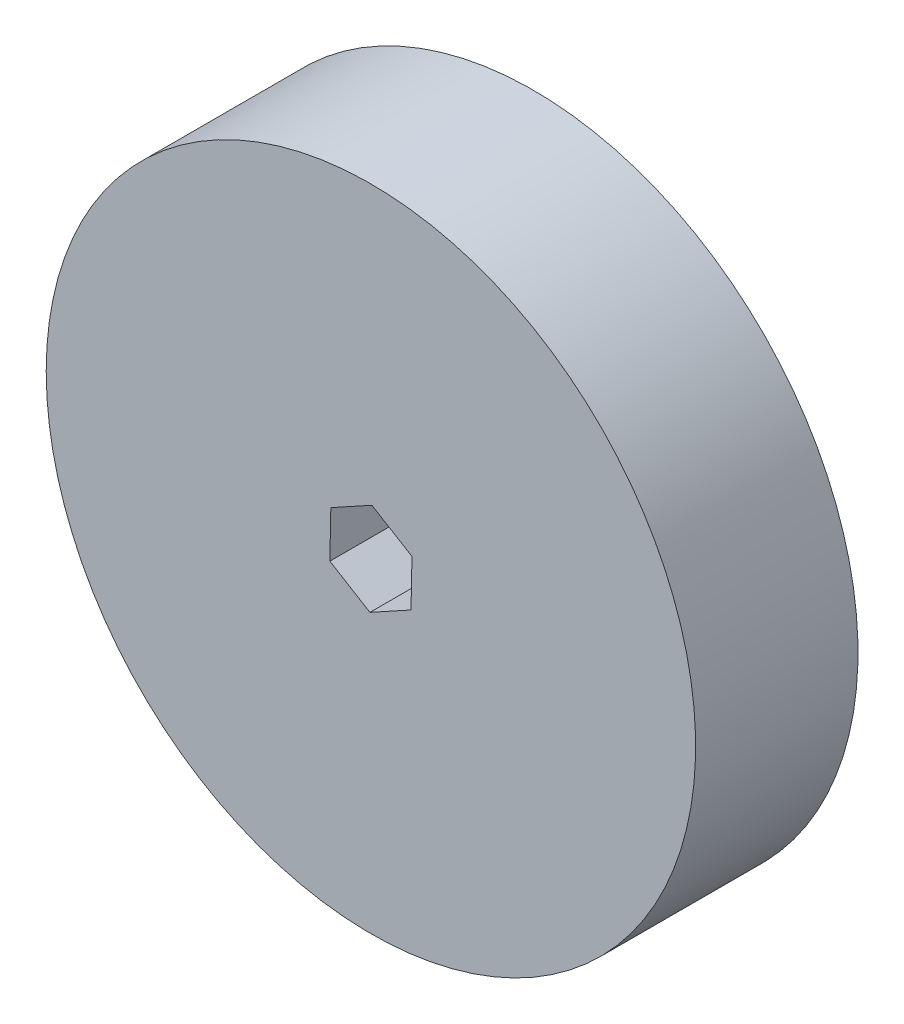
ISO-10303-21;
HEADER;
FILE_DESCRIPTION(('STEP AP214'),'2;1');
FILE_NAME('part.step','',(''),(''),'','','');
FILE_SCHEMA(('AUTOMOTIVE_DESIGN { 1 0 10303 214 1 1 1 1 }'));
ENDSEC;
DATA;
#1=APPLICATION_CONTEXT('core data for automotive mechanical design processes');
#2=APPLICATION_PROTOCOL_DEFINITION('international standard','automotive_design',2000,#1);
#3=PRODUCT_CONTEXT('',#1,'mechanical');
#4=PRODUCT('Part','Part','',(#3));
#5=PRODUCT_RELATED_PRODUCT_CATEGORY('part','',(#4));
#6=PRODUCT_DEFINITION_FORMATION('','',#4);
#7=PRODUCT_DEFINITION_CONTEXT('part definition',#1,'design');
#8=PRODUCT_DEFINITION('design','',#6,#7);
#9=PRODUCT_DEFINITION_SHAPE('','',#8);
#10=(LENGTH_UNIT() NAMED_UNIT(*) SI_UNIT(.MILLI.,.METRE.));
#11=(NAMED_UNIT(*) PLANE_ANGLE_UNIT() SI_UNIT($,.RADIAN.));
#12=(NAMED_UNIT(*) SI_UNIT($,.STERADIAN.) SOLID_ANGLE_UNIT());
#13=UNCERTAINTY_MEASURE_WITH_UNIT(LENGTH_MEASURE(1.E-05),#10,'distance_accuracy_value','');
#14=(GEOMETRIC_REPRESENTATION_CONTEXT(3) GLOBAL_UNCERTAINTY_ASSIGNED_CONTEXT((#13)) GLOBAL_UNIT_ASSIGNED_CONTEXT((#10,
#11,#12)) REPRESENTATION_CONTEXT('',''));
#15=CARTESIAN_POINT('',(0.,0.,0.));
#16=DIRECTION('',(0.,0.,1.));
#17=DIRECTION('',(1.,0.,0.));
#18=AXIS2_PLACEMENT_3D('',#15,#16,#17);
#19=CARTESIAN_POINT('',(0.,0.,19.05));
#20=DIRECTION('',(0.,0.,1.));
#21=DIRECTION('',(1.,0.,0.));
#22=AXIS2_PLACEMENT_3D('',#19,#20,#21);
#23=PLANE('',#22);
#24=CARTESIAN_POINT('',(0.,0.,19.05));
#25=DIRECTION('',(0.,0.,1.));
#26=DIRECTION('',(1.,0.,0.));
#27=AXIS2_PLACEMENT_3D('',#24,#25,#26);
#28=CIRCLE('',#27,38.1);
#29=CARTESIAN_POINT('',(-38.1,0.,19.05));
#30=VERTEX_POINT('',#29);
#31=EDGE_CURVE('E11',#30,#30,#28,.T.);
#32=ORIENTED_EDGE('',*,*,#31,.T.);
#33=EDGE_LOOP('',(#32));
#34=FACE_BOUND('',#33,.T.);
#35=DIRECTION('',(-0.855461834201049,0.517865861227959,0.));
#36=VECTOR('',#35,1.);
#37=CARTESIAN_POINT('',(4.81854024932415,2.65019713712832,19.05));
#38=LINE('',#37,#36);
#39=CARTESIAN_POINT('',(4.81854024932415,2.65019713712832,19.05));
#40=VERTEX_POINT('',#39);
#41=CARTESIAN_POINT('',(0.114132078872162,5.49807683363668,19.05));
#42=VERTEX_POINT('',#41);
#43=EDGE_CURVE('E94',#40,#42,#38,.T.);
#44=ORIENTED_EDGE('',*,*,#43,.F.);
#45=DIRECTION('',(0.020754074475595,0.99978461100012,0.));
#46=VECTOR('',#45,1.);
#47=CARTESIAN_POINT('',(4.70440817045199,-2.84787969650836,19.05));
#48=LINE('',#47,#46);
#49=CARTESIAN_POINT('',(4.70440817045199,-2.84787969650836,19.05));
#50=VERTEX_POINT('',#49);
#51=EDGE_CURVE('E86',#50,#40,#48,.T.);
#52=ORIENTED_EDGE('',*,*,#51,.F.);
#53=DIRECTION('',(0.876215908676644,0.481918749772161,0.));
#54=VECTOR('',#53,1.);
#55=CARTESIAN_POINT('',(-0.114132078872163,-5.49807683363668,19.05));
#56=LINE('',#55,#54);
#57=CARTESIAN_POINT('',(-0.114132078872164,-5.49807683363669,19.05));
#58=VERTEX_POINT('',#57);
#59=EDGE_CURVE('E114',#58,#50,#56,.T.);
#60=ORIENTED_EDGE('',*,*,#59,.F.);
#61=DIRECTION('',(0.855461834201049,-0.51786586122796,0.));
#62=VECTOR('',#61,1.);
#63=CARTESIAN_POINT('',(-4.81854024932415,-2.65019713712832,19.05));
#64=LINE('',#63,#62);
#65=CARTESIAN_POINT('',(-4.81854024932415,-2.65019713712832,19.05));
#66=VERTEX_POINT('',#65);
#67=EDGE_CURVE('E112',#66,#58,#64,.T.);
#68=ORIENTED_EDGE('',*,*,#67,.F.);
#69=DIRECTION('',(-0.020754074475595,-0.99978461100012,0.));
#70=VECTOR('',#69,1.);
#71=CARTESIAN_POINT('',(-4.70440817045199,2.84787969650836,19.05));
#72=LINE('',#71,#70);
#73=CARTESIAN_POINT('',(-4.70440817045199,2.84787969650836,19.05));
#74=VERTEX_POINT('',#73);
#75=EDGE_CURVE('E108',#74,#66,#72,.T.);
#76=ORIENTED_EDGE('',*,*,#75,.F.);
#77=DIRECTION('',(-0.876215908676644,-0.481918749772161,0.));
#78=VECTOR('',#77,1.);
#79=CARTESIAN_POINT('',(0.114132078872162,5.49807683363668,19.05));
#80=LINE('',#79,#78);
#81=EDGE_CURVE('E106',#42,#74,#80,.T.);
#82=ORIENTED_EDGE('',*,*,#81,.F.);
#83=EDGE_LOOP('',(#44,#52,#60,#68,#76,#82));
#84=FACE_BOUND('',#83,.T.);
#85=ADVANCED_FACE('F33',(#34,#84),#23,.T.);
#86=CARTESIAN_POINT('',(0.,0.,0.));
#87=DIRECTION('',(0.,0.,1.));
#88=DIRECTION('',(1.,0.,0.));
#89=AXIS2_PLACEMENT_3D('',#86,#87,#88);
#90=PLANE('',#89);
#91=CARTESIAN_POINT('',(0.,0.,0.));
#92=DIRECTION('',(0.,0.,1.));
#93=DIRECTION('',(1.,0.,0.));
#94=AXIS2_PLACEMENT_3D('',#91,#92,#93);
#95=CIRCLE('',#94,38.1);
#96=CARTESIAN_POINT('',(-38.1,0.,0.));
#97=VERTEX_POINT('',#96);
#98=EDGE_CURVE('E37',#97,#97,#95,.T.);
#99=ORIENTED_EDGE('',*,*,#98,.F.);
#100=EDGE_LOOP('',(#99));
#101=FACE_BOUND('',#100,.T.);
#102=DIRECTION('',(0.020754074475595,0.99978461100012,0.));
#103=VECTOR('',#102,1.);
#104=CARTESIAN_POINT('',(4.70440817045199,-2.84787969650836,0.));
#105=LINE('',#104,#103);
#106=CARTESIAN_POINT('',(4.70440817045199,-2.84787969650836,0.));
#107=VERTEX_POINT('',#106);
#108=CARTESIAN_POINT('',(4.81854024932415,2.65019713712832,0.));
#109=VERTEX_POINT('',#108);
#110=EDGE_CURVE('E56',#107,#109,#105,.T.);
#111=ORIENTED_EDGE('',*,*,#110,.T.);
#112=DIRECTION('',(-0.855461834201049,0.517865861227959,0.));
#113=VECTOR('',#112,1.);
#114=CARTESIAN_POINT('',(4.81854024932415,2.65019713712832,0.));
#115=LINE('',#114,#113);
#116=CARTESIAN_POINT('',(0.114132078872162,5.49807683363668,0.));
#117=VERTEX_POINT('',#116);
#118=EDGE_CURVE('E101',#109,#117,#115,.T.);
#119=ORIENTED_EDGE('',*,*,#118,.T.);
#120=DIRECTION('',(-0.876215908676644,-0.481918749772161,0.));
#121=VECTOR('',#120,1.);
#122=CARTESIAN_POINT('',(0.114132078872162,5.49807683363668,0.));
#123=LINE('',#122,#121);
#124=CARTESIAN_POINT('',(-4.70440817045199,2.84787969650836,0.));
#125=VERTEX_POINT('',#124);
#126=EDGE_CURVE('E118',#117,#125,#123,.T.);
#127=ORIENTED_EDGE('',*,*,#126,.T.);
#128=DIRECTION('',(-0.020754074475595,-0.99978461100012,0.));
#129=VECTOR('',#128,1.);
#130=CARTESIAN_POINT('',(-4.70440817045199,2.84787969650836,0.));
#131=LINE('',#130,#129);
#132=CARTESIAN_POINT('',(-4.81854024932415,-2.65019713712832,0.));
#133=VERTEX_POINT('',#132);
#134=EDGE_CURVE('E121',#125,#133,#131,.T.);
#135=ORIENTED_EDGE('',*,*,#134,.T.);
#136=DIRECTION('',(0.855461834201049,-0.51786586122796,0.));
#137=VECTOR('',#136,1.);
#138=CARTESIAN_POINT('',(-4.81854024932415,-2.65019713712832,0.));
#139=LINE('',#138,#137);
#140=CARTESIAN_POINT('',(-0.114132078872163,-5.49807683363668,0.));
#141=VERTEX_POINT('',#140);
#142=EDGE_CURVE('E124',#133,#141,#139,.T.);
#143=ORIENTED_EDGE('',*,*,#142,.T.);
#144=DIRECTION('',(0.876215908676644,0.481918749772161,0.));
#145=VECTOR('',#144,1.);
#146=CARTESIAN_POINT('',(-0.114132078872163,-5.49807683363668,0.));
#147=LINE('',#146,#145);
#148=EDGE_CURVE('E95',#141,#107,#147,.T.);
#149=ORIENTED_EDGE('',*,*,#148,.T.);
#150=EDGE_LOOP('',(#111,#119,#127,#135,#143,#149));
#151=FACE_BOUND('',#150,.T.);
#152=ADVANCED_FACE('F141',(#101,#151),#90,.F.);
#153=CARTESIAN_POINT('',(0.,0.,19.05));
#154=DIRECTION('',(0.,0.,-1.));
#155=DIRECTION('',(-1.,0.,0.));
#156=AXIS2_PLACEMENT_3D('',#153,#154,#155);
#157=CYLINDRICAL_SURFACE('',#156,38.1);
#158=CARTESIAN_POINT('',(-38.1,0.,19.05));
#159=CARTESIAN_POINT('',(-38.1,0.,18.8515625));
#160=CARTESIAN_POINT('',(-38.1,0.,18.653125));
#161=CARTESIAN_POINT('',(-38.1,0.,18.25625));
#162=CARTESIAN_POINT('',(-38.1,0.,18.0578125));
#163=CARTESIAN_POINT('',(-38.1,0.,17.6609375));
#164=CARTESIAN_POINT('',(-38.1,0.,17.4625));
#165=CARTESIAN_POINT('',(-38.1,0.,17.065625));
#166=CARTESIAN_POINT('',(-38.1,0.,16.8671875));
#167=CARTESIAN_POINT('',(-38.1,0.,16.4703125));
#168=CARTESIAN_POINT('',(-38.1,0.,16.271875));
#169=CARTESIAN_POINT('',(-38.1,0.,15.875));
#170=CARTESIAN_POINT('',(-38.1,0.,15.6765625));
#171=CARTESIAN_POINT('',(-38.1,0.,15.2796875));
#172=CARTESIAN_POINT('',(-38.1,0.,15.08125));
#173=CARTESIAN_POINT('',(-38.1,0.,14.684375));
#174=CARTESIAN_POINT('',(-38.1,0.,14.4859375));
#175=CARTESIAN_POINT('',(-38.1,0.,14.0890625));
#176=CARTESIAN_POINT('',(-38.1,0.,13.890625));
#177=CARTESIAN_POINT('',(-38.1,0.,13.49375));
#178=CARTESIAN_POINT('',(-38.1,0.,13.2953125));
#179=CARTESIAN_POINT('',(-38.1,0.,12.8984375));
#180=CARTESIAN_POINT('',(-38.1,0.,12.7));
#181=CARTESIAN_POINT('',(-38.1,0.,12.303125));
#182=CARTESIAN_POINT('',(-38.1,0.,12.1046875));
#183=CARTESIAN_POINT('',(-38.1,0.,11.7078125));
#184=CARTESIAN_POINT('',(-38.1,0.,11.509375));
#185=CARTESIAN_POINT('',(-38.1,0.,11.1125));
#186=CARTESIAN_POINT('',(-38.1,0.,10.9140625));
#187=CARTESIAN_POINT('',(-38.1,0.,10.5171875));
#188=CARTESIAN_POINT('',(-38.1,0.,10.31875));
#189=CARTESIAN_POINT('',(-38.1,0.,9.921875));
#190=CARTESIAN_POINT('',(-38.1,0.,9.7234375));
#191=CARTESIAN_POINT('',(-38.1,0.,9.3265625));
#192=CARTESIAN_POINT('',(-38.1,0.,9.128125));
#193=CARTESIAN_POINT('',(-38.1,0.,8.73125));
#194=CARTESIAN_POINT('',(-38.1,0.,8.5328125));
#195=CARTESIAN_POINT('',(-38.1,0.,8.1359375));
#196=CARTESIAN_POINT('',(-38.1,0.,7.9375));
#197=CARTESIAN_POINT('',(-38.1,0.,7.540625));
#198=CARTESIAN_POINT('',(-38.1,0.,7.3421875));
#199=CARTESIAN_POINT('',(-38.1,0.,6.9453125));
#200=CARTESIAN_POINT('',(-38.1,0.,6.746875));
#201=CARTESIAN_POINT('',(-38.1,0.,6.35));
#202=CARTESIAN_POINT('',(-38.1,0.,6.1515625));
#203=CARTESIAN_POINT('',(-38.1,0.,5.7546875));
#204=CARTESIAN_POINT('',(-38.1,0.,5.55625));
#205=CARTESIAN_POINT('',(-38.1,0.,5.159375));
#206=CARTESIAN_POINT('',(-38.1,0.,4.9609375));
#207=CARTESIAN_POINT('',(-38.1,0.,4.5640625));
#208=CARTESIAN_POINT('',(-38.1,0.,4.365625));
#209=CARTESIAN_POINT('',(-38.1,0.,3.96875));
#210=CARTESIAN_POINT('',(-38.1,0.,3.7703125));
#211=CARTESIAN_POINT('',(-38.1,0.,3.3734375));
#212=CARTESIAN_POINT('',(-38.1,0.,3.175));
#213=CARTESIAN_POINT('',(-38.1,0.,2.778125));
#214=CARTESIAN_POINT('',(-38.1,0.,2.5796875));
#215=CARTESIAN_POINT('',(-38.1,0.,2.1828125));
#216=CARTESIAN_POINT('',(-38.1,0.,1.984375));
#217=CARTESIAN_POINT('',(-38.1,0.,1.5875));
#218=CARTESIAN_POINT('',(-38.1,0.,1.3890625));
#219=CARTESIAN_POINT('',(-38.1,0.,0.992187500000001));
#220=CARTESIAN_POINT('',(-38.1,0.,0.793750000000001));
#221=CARTESIAN_POINT('',(-38.1,0.,0.396875));
#222=CARTESIAN_POINT('',(-38.1,0.,0.1984375));
#223=CARTESIAN_POINT('',(-38.1,0.,0.));
#224=B_SPLINE_CURVE_WITH_KNOTS('',3,(#158,#159,#160,#161,#162,#163,#164,#165,#166,#167,#168,
#169,#170,#171,#172,#173,#174,#175,#176,#177,#178,#179,#180,#181,#182,#183,#184,#185,#186,#187,
#188,#189,#190,#191,#192,#193,#194,#195,#196,#197,#198,#199,#200,#201,#202,#203,#204,#205,#206,
#207,#208,#209,#210,#211,#212,#213,#214,#215,#216,#217,#218,#219,#220,#221,#222,#223),
.UNSPECIFIED.,.F.,.F.,(4,2,2,2,2,2,2,2,2,2,2,2,2,2,2,2,2,2,2,2,2,2,2,2,2,2,2,2,2,2,2,2,4),(0.,
0.5953125,1.190625,1.7859375,2.38125,2.9765625,3.571875,4.1671875,4.7625,5.3578125,5.953125,
6.5484375,7.14375,7.7390625,8.334375,8.9296875,9.525,10.1203125,10.715625,11.3109375,11.90625,
12.5015625,13.096875,13.6921875,14.2875,14.8828125,15.478125,16.0734375,16.66875,17.2640625,
17.859375,18.4546875,19.05),.UNSPECIFIED.);
#225=EDGE_CURVE('BSEAM35',#30,#97,#224,.T.);
#226=ORIENTED_EDGE('',*,*,#31,.F.);
#227=ORIENTED_EDGE('',*,*,#98,.T.);
#228=ORIENTED_EDGE('',*,*,#225,.T.);
#229=ORIENTED_EDGE('',*,*,#225,.F.);
#230=EDGE_LOOP('',(#226,#228,#227,#229));
#231=FACE_BOUND('',#230,.T.);
#232=ADVANCED_FACE('F35',(#231),#157,.T.);
#233=CARTESIAN_POINT('',(4.70440817045199,-2.84787969650836,19.05));
#234=DIRECTION('',(-0.99978461100012,0.020754074475595,0.));
#235=DIRECTION('',(-0.020754074475595,-0.99978461100012,0.));
#236=AXIS2_PLACEMENT_3D('',#233,#234,#235);
#237=PLANE('',#236);
#238=ORIENTED_EDGE('',*,*,#110,.F.);
#239=DIRECTION('',(0.,0.,-1.));
#240=VECTOR('',#239,1.);
#241=CARTESIAN_POINT('',(4.70440817045199,-2.84787969650836,19.05));
#242=LINE('',#241,#240);
#243=EDGE_CURVE('E90',#50,#107,#242,.T.);
#244=ORIENTED_EDGE('',*,*,#243,.F.);
#245=ORIENTED_EDGE('',*,*,#51,.T.);
#246=DIRECTION('',(0.,0.,-1.));
#247=VECTOR('',#246,1.);
#248=CARTESIAN_POINT('',(4.81854024932415,2.65019713712832,19.05));
#249=LINE('',#248,#247);
#250=EDGE_CURVE('E89',#40,#109,#249,.T.);
#251=ORIENTED_EDGE('',*,*,#250,.T.);
#252=EDGE_LOOP('',(#238,#244,#245,#251));
#253=FACE_BOUND('',#252,.T.);
#254=ADVANCED_FACE('F88',(#253),#237,.T.);
#255=CARTESIAN_POINT('',(4.81854024932415,2.65019713712832,19.05));
#256=DIRECTION('',(-0.517865861227959,-0.855461834201049,0.));
#257=DIRECTION('',(0.855461834201049,-0.517865861227959,0.));
#258=AXIS2_PLACEMENT_3D('',#255,#256,#257);
#259=PLANE('',#258);
#260=ORIENTED_EDGE('',*,*,#118,.F.);
#261=ORIENTED_EDGE('',*,*,#250,.F.);
#262=ORIENTED_EDGE('',*,*,#43,.T.);
#263=DIRECTION('',(0.,0.,-1.));
#264=VECTOR('',#263,1.);
#265=CARTESIAN_POINT('',(0.114132078872162,5.49807683363668,19.05));
#266=LINE('',#265,#264);
#267=EDGE_CURVE('E102',#42,#117,#266,.T.);
#268=ORIENTED_EDGE('',*,*,#267,.T.);
#269=EDGE_LOOP('',(#260,#261,#262,#268));
#270=FACE_BOUND('',#269,.T.);
#271=ADVANCED_FACE('F98',(#270),#259,.T.);
#272=CARTESIAN_POINT('',(0.114132078872162,5.49807683363668,19.05));
#273=DIRECTION('',(0.481918749772161,-0.876215908676644,0.));
#274=DIRECTION('',(0.876215908676644,0.481918749772161,0.));
#275=AXIS2_PLACEMENT_3D('',#272,#273,#274);
#276=PLANE('',#275);
#277=ORIENTED_EDGE('',*,*,#126,.F.);
#278=ORIENTED_EDGE('',*,*,#267,.F.);
#279=ORIENTED_EDGE('',*,*,#81,.T.);
#280=DIRECTION('',(0.,0.,-1.));
#281=VECTOR('',#280,1.);
#282=CARTESIAN_POINT('',(-4.70440817045199,2.84787969650836,19.05));
#283=LINE('',#282,#281);
#284=EDGE_CURVE('E133',#74,#125,#283,.T.);
#285=ORIENTED_EDGE('',*,*,#284,.T.);
#286=EDGE_LOOP('',(#277,#278,#279,#285));
#287=FACE_BOUND('',#286,.T.);
#288=ADVANCED_FACE('F137',(#287),#276,.T.);
#289=CARTESIAN_POINT('',(-4.70440817045199,2.84787969650836,19.05));
#290=DIRECTION('',(0.99978461100012,-0.020754074475595,0.));
#291=DIRECTION('',(0.020754074475595,0.99978461100012,0.));
#292=AXIS2_PLACEMENT_3D('',#289,#290,#291);
#293=PLANE('',#292);
#294=ORIENTED_EDGE('',*,*,#134,.F.);
#295=ORIENTED_EDGE('',*,*,#284,.F.);
#296=ORIENTED_EDGE('',*,*,#75,.T.);
#297=DIRECTION('',(0.,0.,-1.));
#298=VECTOR('',#297,1.);
#299=CARTESIAN_POINT('',(-4.81854024932415,-2.65019713712832,19.05));
#300=LINE('',#299,#298);
#301=EDGE_CURVE('E131',#66,#133,#300,.T.);
#302=ORIENTED_EDGE('',*,*,#301,.T.);
#303=EDGE_LOOP('',(#294,#295,#296,#302));
#304=FACE_BOUND('',#303,.T.);
#305=ADVANCED_FACE('F149',(#304),#293,.T.);
#306=CARTESIAN_POINT('',(-4.81854024932415,-2.65019713712832,19.05));
#307=DIRECTION('',(0.51786586122796,0.855461834201049,0.));
#308=DIRECTION('',(-0.855461834201049,0.51786586122796,0.));
#309=AXIS2_PLACEMENT_3D('',#306,#307,#308);
#310=PLANE('',#309);
#311=ORIENTED_EDGE('',*,*,#142,.F.);
#312=ORIENTED_EDGE('',*,*,#301,.F.);
#313=ORIENTED_EDGE('',*,*,#67,.T.);
#314=DIRECTION('',(0.,0.,-1.));
#315=VECTOR('',#314,1.);
#316=CARTESIAN_POINT('',(-0.114132078872163,-5.49807683363668,19.05));
#317=LINE('',#316,#315);
#318=EDGE_CURVE('E48',#58,#141,#317,.T.);
#319=ORIENTED_EDGE('',*,*,#318,.T.);
#320=EDGE_LOOP('',(#311,#312,#313,#319));
#321=FACE_BOUND('',#320,.T.);
#322=ADVANCED_FACE('F147',(#321),#310,.T.);
#323=CARTESIAN_POINT('',(-0.114132078872163,-5.49807683363668,19.05));
#324=DIRECTION('',(-0.481918749772161,0.876215908676644,0.));
#325=DIRECTION('',(-0.876215908676644,-0.481918749772161,0.));
#326=AXIS2_PLACEMENT_3D('',#323,#324,#325);
#327=PLANE('',#326);
#328=ORIENTED_EDGE('',*,*,#148,.F.);
#329=ORIENTED_EDGE('',*,*,#318,.F.);
#330=ORIENTED_EDGE('',*,*,#59,.T.);
#331=ORIENTED_EDGE('',*,*,#243,.T.);
#332=EDGE_LOOP('',(#328,#329,#330,#331));
#333=FACE_BOUND('',#332,.T.);
#334=ADVANCED_FACE('F143',(#333),#327,.T.);
#335=CLOSED_SHELL('',(#85,#152,#232,#254,#271,#288,#305,#322,#334));
#336=MANIFOLD_SOLID_BREP('B2',#335);
#337=ADVANCED_BREP_SHAPE_REPRESENTATION('',(#18,#336),#14);
#338=SHAPE_DEFINITION_REPRESENTATION(#9,#337);
ENDSEC;
END-ISO-10303-21;
